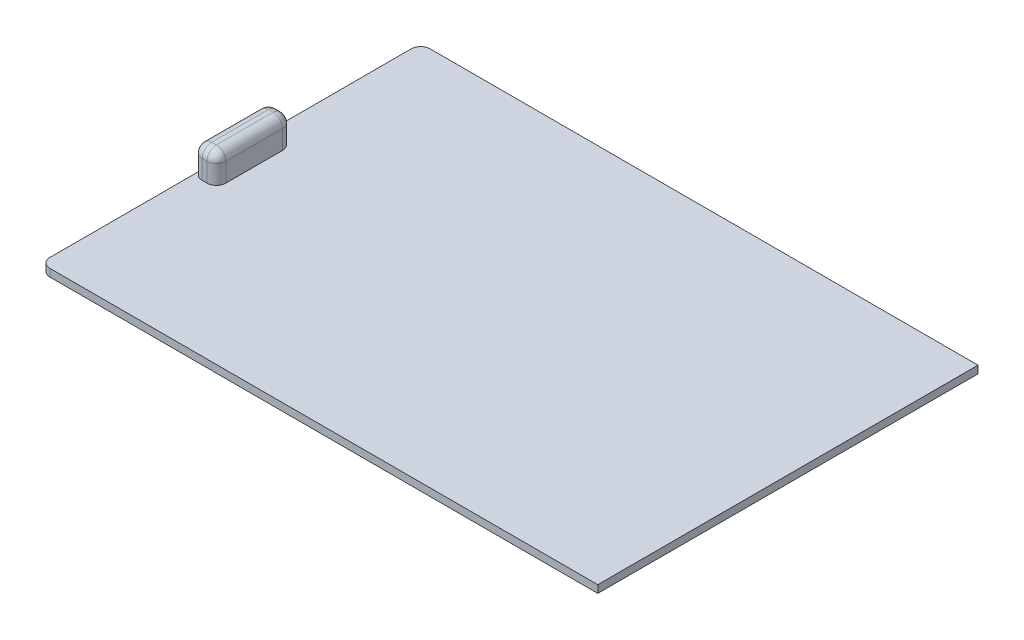
ISO-10303-21;
HEADER;
FILE_DESCRIPTION(('STEP AP214'),'2;1');
FILE_NAME('part.step','',(''),(''),'','','');
FILE_SCHEMA(('AUTOMOTIVE_DESIGN { 1 0 10303 214 1 1 1 1 }'));
ENDSEC;
DATA;
#1=APPLICATION_CONTEXT('core data for automotive mechanical design processes');
#2=APPLICATION_PROTOCOL_DEFINITION('international standard','automotive_design',2000,#1);
#3=PRODUCT_CONTEXT('',#1,'mechanical');
#4=PRODUCT('Part','Part','',(#3));
#5=PRODUCT_RELATED_PRODUCT_CATEGORY('part','',(#4));
#6=PRODUCT_DEFINITION_FORMATION('','',#4);
#7=PRODUCT_DEFINITION_CONTEXT('part definition',#1,'design');
#8=PRODUCT_DEFINITION('design','',#6,#7);
#9=PRODUCT_DEFINITION_SHAPE('','',#8);
#10=(LENGTH_UNIT() NAMED_UNIT(*) SI_UNIT(.MILLI.,.METRE.));
#11=(NAMED_UNIT(*) PLANE_ANGLE_UNIT() SI_UNIT($,.RADIAN.));
#12=(NAMED_UNIT(*) SI_UNIT($,.STERADIAN.) SOLID_ANGLE_UNIT());
#13=UNCERTAINTY_MEASURE_WITH_UNIT(LENGTH_MEASURE(1.E-05),#10,'distance_accuracy_value','');
#14=(GEOMETRIC_REPRESENTATION_CONTEXT(3) GLOBAL_UNCERTAINTY_ASSIGNED_CONTEXT((#13)) GLOBAL_UNIT_ASSIGNED_CONTEXT((#10,
#11,#12)) REPRESENTATION_CONTEXT('',''));
#15=CARTESIAN_POINT('',(0.,0.,0.));
#16=DIRECTION('',(0.,0.,1.));
#17=DIRECTION('',(1.,0.,0.));
#18=AXIS2_PLACEMENT_3D('',#15,#16,#17);
#19=CARTESIAN_POINT('',(0.,1.6,80.5));
#20=DIRECTION('',(1.,0.,0.));
#21=DIRECTION('',(0.,0.,-1.));
#22=AXIS2_PLACEMENT_3D('',#19,#20,#21);
#23=PLANE('',#22);
#24=DIRECTION('',(0.,0.,1.));
#25=VECTOR('',#24,1.);
#26=CARTESIAN_POINT('',(0.,1.6,80.5));
#27=LINE('',#26,#25);
#28=CARTESIAN_POINT('',(0.,1.6,46.25));
#29=VERTEX_POINT('',#28);
#30=CARTESIAN_POINT('',(0.,1.6,78.5));
#31=VERTEX_POINT('',#30);
#32=EDGE_CURVE('E74',#29,#31,#27,.T.);
#33=ORIENTED_EDGE('',*,*,#32,.F.);
#34=DIRECTION('',(0.,-1.,0.));
#35=VECTOR('',#34,1.);
#36=CARTESIAN_POINT('',(0.,7.6,46.25));
#37=LINE('',#36,#35);
#38=CARTESIAN_POINT('',(0.,5.6,46.25));
#39=VERTEX_POINT('',#38);
#40=EDGE_CURVE('E79',#29,#39,#37,.F.);
#41=ORIENTED_EDGE('',*,*,#40,.T.);
#42=DIRECTION('',(0.,0.,1.));
#43=VECTOR('',#42,1.);
#44=CARTESIAN_POINT('',(0.,5.6,80.5));
#45=LINE('',#44,#43);
#46=CARTESIAN_POINT('',(0.,5.6,34.25));
#47=VERTEX_POINT('',#46);
#48=EDGE_CURVE('E289',#39,#47,#45,.F.);
#49=ORIENTED_EDGE('',*,*,#48,.T.);
#50=DIRECTION('',(0.,-1.,0.));
#51=VECTOR('',#50,1.);
#52=CARTESIAN_POINT('',(0.,1.6,34.25));
#53=LINE('',#52,#51);
#54=CARTESIAN_POINT('',(0.,1.6,34.25));
#55=VERTEX_POINT('',#54);
#56=EDGE_CURVE('E285',#47,#55,#53,.T.);
#57=ORIENTED_EDGE('',*,*,#56,.T.);
#58=CARTESIAN_POINT('',(0.,1.6,2.));
#59=VERTEX_POINT('',#58);
#60=EDGE_CURVE('E182',#59,#55,#27,.T.);
#61=ORIENTED_EDGE('',*,*,#60,.F.);
#62=DIRECTION('',(0.,-1.,0.));
#63=VECTOR('',#62,1.);
#64=CARTESIAN_POINT('',(0.,1.6,2.));
#65=LINE('',#64,#63);
#66=CARTESIAN_POINT('',(0.,0.,2.));
#67=VERTEX_POINT('',#66);
#68=EDGE_CURVE('E223',#59,#67,#65,.T.);
#69=ORIENTED_EDGE('',*,*,#68,.T.);
#70=DIRECTION('',(0.,0.,1.));
#71=VECTOR('',#70,1.);
#72=CARTESIAN_POINT('',(0.,0.,80.5));
#73=LINE('',#72,#71);
#74=CARTESIAN_POINT('',(0.,0.,78.5));
#75=VERTEX_POINT('',#74);
#76=EDGE_CURVE('E205',#67,#75,#73,.T.);
#77=ORIENTED_EDGE('',*,*,#76,.T.);
#78=DIRECTION('',(0.,-1.,0.));
#79=VECTOR('',#78,1.);
#80=CARTESIAN_POINT('',(0.,1.6,78.5));
#81=LINE('',#80,#79);
#82=EDGE_CURVE('E192',#75,#31,#81,.F.);
#83=ORIENTED_EDGE('',*,*,#82,.T.);
#84=EDGE_LOOP('',(#33,#41,#49,#57,#61,#69,#77,#83));
#85=FACE_BOUND('',#84,.T.);
#86=ADVANCED_FACE('F56',(#85),#23,.F.);
#87=CARTESIAN_POINT('',(0.,1.6,80.5));
#88=DIRECTION('',(0.,0.,-1.));
#89=DIRECTION('',(-1.,0.,0.));
#90=AXIS2_PLACEMENT_3D('',#87,#88,#89);
#91=PLANE('',#90);
#92=DIRECTION('',(1.,0.,0.));
#93=VECTOR('',#92,1.);
#94=CARTESIAN_POINT('',(0.,1.6,80.5));
#95=LINE('',#94,#93);
#96=CARTESIAN_POINT('',(2.,1.6,80.5));
#97=VERTEX_POINT('',#96);
#98=CARTESIAN_POINT('',(118.,1.6,80.5));
#99=VERTEX_POINT('',#98);
#100=EDGE_CURVE('E169',#97,#99,#95,.T.);
#101=ORIENTED_EDGE('',*,*,#100,.F.);
#102=DIRECTION('',(0.,-1.,0.));
#103=VECTOR('',#102,1.);
#104=CARTESIAN_POINT('',(2.,1.6,80.5));
#105=LINE('',#104,#103);
#106=CARTESIAN_POINT('',(2.,0.,80.5));
#107=VERTEX_POINT('',#106);
#108=EDGE_CURVE('E241',#97,#107,#105,.T.);
#109=ORIENTED_EDGE('',*,*,#108,.T.);
#110=DIRECTION('',(1.,0.,0.));
#111=VECTOR('',#110,1.);
#112=CARTESIAN_POINT('',(0.,0.,80.5));
#113=LINE('',#112,#111);
#114=CARTESIAN_POINT('',(118.,0.,80.5));
#115=VERTEX_POINT('',#114);
#116=EDGE_CURVE('E188',#107,#115,#113,.T.);
#117=ORIENTED_EDGE('',*,*,#116,.T.);
#118=DIRECTION('',(0.,-1.,0.));
#119=VECTOR('',#118,1.);
#120=CARTESIAN_POINT('',(118.,1.6,80.5));
#121=LINE('',#120,#119);
#122=EDGE_CURVE('E185',#99,#115,#121,.T.);
#123=ORIENTED_EDGE('',*,*,#122,.F.);
#124=EDGE_LOOP('',(#101,#109,#117,#123));
#125=FACE_BOUND('',#124,.T.);
#126=ADVANCED_FACE('F186',(#125),#91,.F.);
#127=CARTESIAN_POINT('',(118.,1.6,80.5));
#128=DIRECTION('',(-1.,0.,0.));
#129=DIRECTION('',(0.,0.,1.));
#130=AXIS2_PLACEMENT_3D('',#127,#128,#129);
#131=PLANE('',#130);
#132=DIRECTION('',(0.,0.,-1.));
#133=VECTOR('',#132,1.);
#134=CARTESIAN_POINT('',(118.,0.,80.5));
#135=LINE('',#134,#133);
#136=CARTESIAN_POINT('',(118.,0.,0.));
#137=VERTEX_POINT('',#136);
#138=EDGE_CURVE('E212',#115,#137,#135,.T.);
#139=ORIENTED_EDGE('',*,*,#138,.T.);
#140=DIRECTION('',(0.,-1.,0.));
#141=VECTOR('',#140,1.);
#142=CARTESIAN_POINT('',(118.,1.6,0.));
#143=LINE('',#142,#141);
#144=CARTESIAN_POINT('',(118.,1.6,0.));
#145=VERTEX_POINT('',#144);
#146=EDGE_CURVE('E193',#145,#137,#143,.T.);
#147=ORIENTED_EDGE('',*,*,#146,.F.);
#148=DIRECTION('',(0.,0.,-1.));
#149=VECTOR('',#148,1.);
#150=CARTESIAN_POINT('',(118.,1.6,80.5));
#151=LINE('',#150,#149);
#152=EDGE_CURVE('E174',#99,#145,#151,.T.);
#153=ORIENTED_EDGE('',*,*,#152,.F.);
#154=ORIENTED_EDGE('',*,*,#122,.T.);
#155=EDGE_LOOP('',(#139,#147,#153,#154));
#156=FACE_BOUND('',#155,.T.);
#157=ADVANCED_FACE('F195',(#156),#131,.F.);
#158=CARTESIAN_POINT('',(0.,1.6,0.));
#159=DIRECTION('',(0.,0.,1.));
#160=DIRECTION('',(1.,0.,0.));
#161=AXIS2_PLACEMENT_3D('',#158,#159,#160);
#162=PLANE('',#161);
#163=DIRECTION('',(-1.,0.,0.));
#164=VECTOR('',#163,1.);
#165=CARTESIAN_POINT('',(0.,0.,0.));
#166=LINE('',#165,#164);
#167=CARTESIAN_POINT('',(2.,0.,0.));
#168=VERTEX_POINT('',#167);
#169=EDGE_CURVE('E215',#137,#168,#166,.T.);
#170=ORIENTED_EDGE('',*,*,#169,.T.);
#171=DIRECTION('',(0.,-1.,0.));
#172=VECTOR('',#171,1.);
#173=CARTESIAN_POINT('',(2.,1.6,0.));
#174=LINE('',#173,#172);
#175=CARTESIAN_POINT('',(2.,1.6,0.));
#176=VERTEX_POINT('',#175);
#177=EDGE_CURVE('E233',#168,#176,#174,.F.);
#178=ORIENTED_EDGE('',*,*,#177,.T.);
#179=DIRECTION('',(-1.,0.,0.));
#180=VECTOR('',#179,1.);
#181=CARTESIAN_POINT('',(0.,1.6,0.));
#182=LINE('',#181,#180);
#183=EDGE_CURVE('E199',#145,#176,#182,.T.);
#184=ORIENTED_EDGE('',*,*,#183,.F.);
#185=ORIENTED_EDGE('',*,*,#146,.T.);
#186=EDGE_LOOP('',(#170,#178,#184,#185));
#187=FACE_BOUND('',#186,.T.);
#188=ADVANCED_FACE('F371',(#187),#162,.F.);
#189=CARTESIAN_POINT('',(0.,1.6,0.));
#190=DIRECTION('',(0.,-1.,0.));
#191=DIRECTION('',(0.,0.,-1.));
#192=AXIS2_PLACEMENT_3D('',#189,#190,#191);
#193=PLANE('',#192);
#194=ORIENTED_EDGE('',*,*,#60,.T.);
#195=CARTESIAN_POINT('',(2.,1.6,34.25));
#196=DIRECTION('',(0.,-1.,0.));
#197=DIRECTION('',(0.,0.,-1.));
#198=AXIS2_PLACEMENT_3D('',#195,#196,#197);
#199=CIRCLE('',#198,2.);
#200=CARTESIAN_POINT('',(2.,1.6,32.25));
#201=VERTEX_POINT('',#200);
#202=EDGE_CURVE('E13',#55,#201,#199,.T.);
#203=ORIENTED_EDGE('',*,*,#202,.T.);
#204=DIRECTION('',(1.,0.,0.));
#205=VECTOR('',#204,1.);
#206=CARTESIAN_POINT('',(0.,1.6,32.25));
#207=LINE('',#206,#205);
#208=CARTESIAN_POINT('',(3.,1.6,32.25));
#209=VERTEX_POINT('',#208);
#210=EDGE_CURVE('E209',#201,#209,#207,.T.);
#211=ORIENTED_EDGE('',*,*,#210,.T.);
#212=CARTESIAN_POINT('',(3.,1.6,34.25));
#213=DIRECTION('',(0.,-1.,0.));
#214=DIRECTION('',(0.,0.,-1.));
#215=AXIS2_PLACEMENT_3D('',#212,#213,#214);
#216=CIRCLE('',#215,2.);
#217=CARTESIAN_POINT('',(5.,1.6,34.25));
#218=VERTEX_POINT('',#217);
#219=EDGE_CURVE('E294',#209,#218,#216,.T.);
#220=ORIENTED_EDGE('',*,*,#219,.T.);
#221=DIRECTION('',(0.,0.,1.));
#222=VECTOR('',#221,1.);
#223=CARTESIAN_POINT('',(5.,1.6,32.25));
#224=LINE('',#223,#222);
#225=CARTESIAN_POINT('',(5.00000000000001,1.6,46.25));
#226=VERTEX_POINT('',#225);
#227=EDGE_CURVE('E350',#218,#226,#224,.T.);
#228=ORIENTED_EDGE('',*,*,#227,.T.);
#229=CARTESIAN_POINT('',(3.,1.6,46.25));
#230=DIRECTION('',(0.,-1.,0.));
#231=DIRECTION('',(0.,0.,-1.));
#232=AXIS2_PLACEMENT_3D('',#229,#230,#231);
#233=CIRCLE('',#232,2.);
#234=CARTESIAN_POINT('',(3.,1.6,48.25));
#235=VERTEX_POINT('',#234);
#236=EDGE_CURVE('E297',#226,#235,#233,.T.);
#237=ORIENTED_EDGE('',*,*,#236,.T.);
#238=DIRECTION('',(-1.,0.,0.));
#239=VECTOR('',#238,1.);
#240=CARTESIAN_POINT('',(5.00000000000001,1.6,48.25));
#241=LINE('',#240,#239);
#242=CARTESIAN_POINT('',(2.,1.6,48.25));
#243=VERTEX_POINT('',#242);
#244=EDGE_CURVE('E346',#235,#243,#241,.T.);
#245=ORIENTED_EDGE('',*,*,#244,.T.);
#246=CARTESIAN_POINT('',(2.,1.6,46.25));
#247=DIRECTION('',(0.,-1.,0.));
#248=DIRECTION('',(0.,0.,-1.));
#249=AXIS2_PLACEMENT_3D('',#246,#247,#248);
#250=CIRCLE('',#249,2.);
#251=EDGE_CURVE('E66',#243,#29,#250,.T.);
#252=ORIENTED_EDGE('',*,*,#251,.T.);
#253=ORIENTED_EDGE('',*,*,#32,.T.);
#254=CARTESIAN_POINT('',(2.,1.6,78.5));
#255=DIRECTION('',(0.,-1.,0.));
#256=DIRECTION('',(0.,0.,-1.));
#257=AXIS2_PLACEMENT_3D('',#254,#255,#256);
#258=CIRCLE('',#257,2.);
#259=EDGE_CURVE('E177',#31,#97,#258,.F.);
#260=ORIENTED_EDGE('',*,*,#259,.T.);
#261=ORIENTED_EDGE('',*,*,#100,.T.);
#262=ORIENTED_EDGE('',*,*,#152,.T.);
#263=ORIENTED_EDGE('',*,*,#183,.T.);
#264=CARTESIAN_POINT('',(2.,1.6,2.));
#265=DIRECTION('',(0.,-1.,0.));
#266=DIRECTION('',(0.,0.,-1.));
#267=AXIS2_PLACEMENT_3D('',#264,#265,#266);
#268=CIRCLE('',#267,2.);
#269=EDGE_CURVE('E238',#176,#59,#268,.F.);
#270=ORIENTED_EDGE('',*,*,#269,.T.);
#271=EDGE_LOOP('',(#194,#203,#211,#220,#228,#237,#245,#252,#253,#260,#261,#262,#263,#270));
#272=FACE_BOUND('',#271,.T.);
#273=ADVANCED_FACE('F171',(#272),#193,.F.);
#274=CARTESIAN_POINT('',(0.,0.,0.));
#275=DIRECTION('',(0.,-1.,0.));
#276=DIRECTION('',(0.,0.,-1.));
#277=AXIS2_PLACEMENT_3D('',#274,#275,#276);
#278=PLANE('',#277);
#279=ORIENTED_EDGE('',*,*,#76,.F.);
#280=CARTESIAN_POINT('',(2.,0.,2.));
#281=DIRECTION('',(0.,-1.,0.));
#282=DIRECTION('',(0.,0.,-1.));
#283=AXIS2_PLACEMENT_3D('',#280,#281,#282);
#284=CIRCLE('',#283,2.);
#285=EDGE_CURVE('E230',#67,#168,#284,.T.);
#286=ORIENTED_EDGE('',*,*,#285,.T.);
#287=ORIENTED_EDGE('',*,*,#169,.F.);
#288=ORIENTED_EDGE('',*,*,#138,.F.);
#289=ORIENTED_EDGE('',*,*,#116,.F.);
#290=CARTESIAN_POINT('',(2.,0.,78.5));
#291=DIRECTION('',(0.,-1.,0.));
#292=DIRECTION('',(0.,0.,-1.));
#293=AXIS2_PLACEMENT_3D('',#290,#291,#292);
#294=CIRCLE('',#293,2.);
#295=EDGE_CURVE('E227',#107,#75,#294,.T.);
#296=ORIENTED_EDGE('',*,*,#295,.T.);
#297=EDGE_LOOP('',(#279,#286,#287,#288,#289,#296));
#298=FACE_BOUND('',#297,.T.);
#299=ADVANCED_FACE('F368',(#298),#278,.T.);
#300=CARTESIAN_POINT('',(2.,1.6,2.));
#301=DIRECTION('',(0.,-1.,0.));
#302=DIRECTION('',(0.,0.,-1.));
#303=AXIS2_PLACEMENT_3D('',#300,#301,#302);
#304=CYLINDRICAL_SURFACE('',#303,2.);
#305=ORIENTED_EDGE('',*,*,#269,.F.);
#306=ORIENTED_EDGE('',*,*,#177,.F.);
#307=ORIENTED_EDGE('',*,*,#285,.F.);
#308=ORIENTED_EDGE('',*,*,#68,.F.);
#309=EDGE_LOOP('',(#305,#306,#307,#308));
#310=FACE_BOUND('',#309,.T.);
#311=ADVANCED_FACE('F376',(#310),#304,.T.);
#312=CARTESIAN_POINT('',(2.,1.6,78.5));
#313=DIRECTION('',(0.,-1.,0.));
#314=DIRECTION('',(0.,0.,-1.));
#315=AXIS2_PLACEMENT_3D('',#312,#313,#314);
#316=CYLINDRICAL_SURFACE('',#315,2.);
#317=ORIENTED_EDGE('',*,*,#259,.F.);
#318=ORIENTED_EDGE('',*,*,#82,.F.);
#319=ORIENTED_EDGE('',*,*,#295,.F.);
#320=ORIENTED_EDGE('',*,*,#108,.F.);
#321=EDGE_LOOP('',(#317,#318,#319,#320));
#322=FACE_BOUND('',#321,.T.);
#323=ADVANCED_FACE('F366',(#322),#316,.T.);
#324=CARTESIAN_POINT('',(5.00000000000001,7.6,48.25));
#325=DIRECTION('',(0.,0.,1.));
#326=DIRECTION('',(1.,0.,0.));
#327=AXIS2_PLACEMENT_3D('',#324,#325,#326);
#328=PLANE('',#327);
#329=ORIENTED_EDGE('',*,*,#244,.F.);
#330=DIRECTION('',(0.,-1.,0.));
#331=VECTOR('',#330,1.);
#332=CARTESIAN_POINT('',(3.,7.6,48.25));
#333=LINE('',#332,#331);
#334=CARTESIAN_POINT('',(3.,5.6,48.25));
#335=VERTEX_POINT('',#334);
#336=EDGE_CURVE('E273',#235,#335,#333,.F.);
#337=ORIENTED_EDGE('',*,*,#336,.T.);
#338=DIRECTION('',(-1.,0.,0.));
#339=VECTOR('',#338,1.);
#340=CARTESIAN_POINT('',(0.,5.6,48.25));
#341=LINE('',#340,#339);
#342=CARTESIAN_POINT('',(2.,5.6,48.25));
#343=VERTEX_POINT('',#342);
#344=EDGE_CURVE('E270',#335,#343,#341,.T.);
#345=ORIENTED_EDGE('',*,*,#344,.T.);
#346=DIRECTION('',(0.,-1.,0.));
#347=VECTOR('',#346,1.);
#348=CARTESIAN_POINT('',(2.,1.6,48.25));
#349=LINE('',#348,#347);
#350=EDGE_CURVE('E267',#343,#243,#349,.T.);
#351=ORIENTED_EDGE('',*,*,#350,.T.);
#352=EDGE_LOOP('',(#329,#337,#345,#351));
#353=FACE_BOUND('',#352,.T.);
#354=ADVANCED_FACE('F423',(#353),#328,.T.);
#355=CARTESIAN_POINT('',(5.,7.6,32.25));
#356=DIRECTION('',(1.,0.,0.));
#357=DIRECTION('',(0.,0.,-1.));
#358=AXIS2_PLACEMENT_3D('',#355,#356,#357);
#359=PLANE('',#358);
#360=ORIENTED_EDGE('',*,*,#227,.F.);
#361=DIRECTION('',(0.,-1.,0.));
#362=VECTOR('',#361,1.);
#363=CARTESIAN_POINT('',(5.,7.6,34.25));
#364=LINE('',#363,#362);
#365=CARTESIAN_POINT('',(5.,5.6,34.25));
#366=VERTEX_POINT('',#365);
#367=EDGE_CURVE('E282',#218,#366,#364,.F.);
#368=ORIENTED_EDGE('',*,*,#367,.T.);
#369=DIRECTION('',(0.,0.,1.));
#370=VECTOR('',#369,1.);
#371=CARTESIAN_POINT('',(5.00000000000001,5.6,48.25));
#372=LINE('',#371,#370);
#373=CARTESIAN_POINT('',(5.00000000000001,5.6,46.25));
#374=VERTEX_POINT('',#373);
#375=EDGE_CURVE('E279',#366,#374,#372,.T.);
#376=ORIENTED_EDGE('',*,*,#375,.T.);
#377=DIRECTION('',(0.,-1.,0.));
#378=VECTOR('',#377,1.);
#379=CARTESIAN_POINT('',(5.00000000000001,7.6,46.25));
#380=LINE('',#379,#378);
#381=EDGE_CURVE('E276',#374,#226,#380,.T.);
#382=ORIENTED_EDGE('',*,*,#381,.T.);
#383=EDGE_LOOP('',(#360,#368,#376,#382));
#384=FACE_BOUND('',#383,.T.);
#385=ADVANCED_FACE('F398',(#384),#359,.T.);
#386=CARTESIAN_POINT('',(0.,7.6,32.25));
#387=DIRECTION('',(0.,0.,-1.));
#388=DIRECTION('',(-1.,0.,0.));
#389=AXIS2_PLACEMENT_3D('',#386,#387,#388);
#390=PLANE('',#389);
#391=DIRECTION('',(1.,0.,0.));
#392=VECTOR('',#391,1.);
#393=CARTESIAN_POINT('',(5.,5.6,32.25));
#394=LINE('',#393,#392);
#395=CARTESIAN_POINT('',(2.,5.6,32.25));
#396=VERTEX_POINT('',#395);
#397=CARTESIAN_POINT('',(3.,5.6,32.25));
#398=VERTEX_POINT('',#397);
#399=EDGE_CURVE('E247',#396,#398,#394,.T.);
#400=ORIENTED_EDGE('',*,*,#399,.T.);
#401=DIRECTION('',(0.,-1.,0.));
#402=VECTOR('',#401,1.);
#403=CARTESIAN_POINT('',(3.,7.6,32.25));
#404=LINE('',#403,#402);
#405=EDGE_CURVE('E251',#398,#209,#404,.T.);
#406=ORIENTED_EDGE('',*,*,#405,.T.);
#407=ORIENTED_EDGE('',*,*,#210,.F.);
#408=DIRECTION('',(0.,-1.,0.));
#409=VECTOR('',#408,1.);
#410=CARTESIAN_POINT('',(2.,7.6,32.25));
#411=LINE('',#410,#409);
#412=EDGE_CURVE('E244',#201,#396,#411,.F.);
#413=ORIENTED_EDGE('',*,*,#412,.T.);
#414=EDGE_LOOP('',(#400,#406,#407,#413));
#415=FACE_BOUND('',#414,.T.);
#416=ADVANCED_FACE('F388',(#415),#390,.T.);
#417=CARTESIAN_POINT('',(0.,7.6,0.));
#418=DIRECTION('',(0.,-1.,0.));
#419=DIRECTION('',(0.,0.,-1.));
#420=AXIS2_PLACEMENT_3D('',#417,#418,#419);
#421=PLANE('',#420);
#422=DIRECTION('',(-1.,0.,0.));
#423=VECTOR('',#422,1.);
#424=CARTESIAN_POINT('',(5.00000000000001,7.6,46.25));
#425=LINE('',#424,#423);
#426=CARTESIAN_POINT('',(2.,7.6,46.25));
#427=VERTEX_POINT('',#426);
#428=CARTESIAN_POINT('',(3.,7.6,46.25));
#429=VERTEX_POINT('',#428);
#430=EDGE_CURVE('E257',#427,#429,#425,.F.);
#431=ORIENTED_EDGE('',*,*,#430,.T.);
#432=DIRECTION('',(0.,0.,1.));
#433=VECTOR('',#432,1.);
#434=CARTESIAN_POINT('',(3.,7.6,32.25));
#435=LINE('',#434,#433);
#436=CARTESIAN_POINT('',(3.,7.6,34.25));
#437=VERTEX_POINT('',#436);
#438=EDGE_CURVE('E264',#429,#437,#435,.F.);
#439=ORIENTED_EDGE('',*,*,#438,.T.);
#440=DIRECTION('',(1.,0.,0.));
#441=VECTOR('',#440,1.);
#442=CARTESIAN_POINT('',(0.,7.6,34.25));
#443=LINE('',#442,#441);
#444=CARTESIAN_POINT('',(2.,7.6,34.25));
#445=VERTEX_POINT('',#444);
#446=EDGE_CURVE('E260',#437,#445,#443,.F.);
#447=ORIENTED_EDGE('',*,*,#446,.T.);
#448=DIRECTION('',(0.,0.,1.));
#449=VECTOR('',#448,1.);
#450=CARTESIAN_POINT('',(2.,7.6,0.));
#451=LINE('',#450,#449);
#452=EDGE_CURVE('E254',#445,#427,#451,.T.);
#453=ORIENTED_EDGE('',*,*,#452,.T.);
#454=EDGE_LOOP('',(#431,#439,#447,#453));
#455=FACE_BOUND('',#454,.T.);
#456=ADVANCED_FACE('F415',(#455),#421,.F.);
#457=CARTESIAN_POINT('',(2.,7.6,46.25));
#458=DIRECTION('',(0.,1.,0.));
#459=DIRECTION('',(0.,0.,1.));
#460=AXIS2_PLACEMENT_3D('',#457,#458,#459);
#461=CYLINDRICAL_SURFACE('',#460,2.);
#462=ORIENTED_EDGE('',*,*,#251,.F.);
#463=ORIENTED_EDGE('',*,*,#350,.F.);
#464=CARTESIAN_POINT('',(2.,5.6,46.25));
#465=DIRECTION('',(0.,1.,0.));
#466=DIRECTION('',(0.,0.,1.));
#467=AXIS2_PLACEMENT_3D('',#464,#465,#466);
#468=CIRCLE('',#467,2.);
#469=EDGE_CURVE('E339',#39,#343,#468,.T.);
#470=ORIENTED_EDGE('',*,*,#469,.F.);
#471=ORIENTED_EDGE('',*,*,#40,.F.);
#472=EDGE_LOOP('',(#462,#463,#470,#471));
#473=FACE_BOUND('',#472,.T.);
#474=ADVANCED_FACE('F58',(#473),#461,.T.);
#475=CARTESIAN_POINT('',(3.,7.6,46.25));
#476=DIRECTION('',(0.,-1.,0.));
#477=DIRECTION('',(0.,0.,-1.));
#478=AXIS2_PLACEMENT_3D('',#475,#476,#477);
#479=CYLINDRICAL_SURFACE('',#478,2.);
#480=ORIENTED_EDGE('',*,*,#236,.F.);
#481=ORIENTED_EDGE('',*,*,#381,.F.);
#482=CARTESIAN_POINT('',(3.,5.6,46.25));
#483=DIRECTION('',(0.,1.,0.));
#484=DIRECTION('',(0.,0.,1.));
#485=AXIS2_PLACEMENT_3D('',#482,#483,#484);
#486=CIRCLE('',#485,2.);
#487=EDGE_CURVE('E336',#335,#374,#486,.T.);
#488=ORIENTED_EDGE('',*,*,#487,.F.);
#489=ORIENTED_EDGE('',*,*,#336,.F.);
#490=EDGE_LOOP('',(#480,#481,#488,#489));
#491=FACE_BOUND('',#490,.T.);
#492=ADVANCED_FACE('F403',(#491),#479,.T.);
#493=CARTESIAN_POINT('',(5.00000000000001,5.6,46.25));
#494=DIRECTION('',(1.,0.,0.));
#495=DIRECTION('',(0.,0.,-1.));
#496=AXIS2_PLACEMENT_3D('',#493,#494,#495);
#497=CYLINDRICAL_SURFACE('',#496,2.);
#498=CARTESIAN_POINT('',(2.,5.6,46.25));
#499=DIRECTION('',(-1.,0.,0.));
#500=DIRECTION('',(0.,0.,1.));
#501=AXIS2_PLACEMENT_3D('',#498,#499,#500);
#502=CIRCLE('',#501,2.);
#503=EDGE_CURVE('E60',#343,#427,#502,.T.);
#504=ORIENTED_EDGE('',*,*,#503,.F.);
#505=ORIENTED_EDGE('',*,*,#344,.F.);
#506=CARTESIAN_POINT('',(3.,5.6,46.25));
#507=DIRECTION('',(1.,0.,0.));
#508=DIRECTION('',(0.,0.,-1.));
#509=AXIS2_PLACEMENT_3D('',#506,#507,#508);
#510=CIRCLE('',#509,2.);
#511=EDGE_CURVE('E332',#429,#335,#510,.T.);
#512=ORIENTED_EDGE('',*,*,#511,.F.);
#513=ORIENTED_EDGE('',*,*,#430,.F.);
#514=EDGE_LOOP('',(#504,#505,#512,#513));
#515=FACE_BOUND('',#514,.T.);
#516=ADVANCED_FACE('F420',(#515),#497,.T.);
#517=CARTESIAN_POINT('',(2.,5.6,46.25));
#518=DIRECTION('',(0.,0.,1.));
#519=DIRECTION('',(1.,0.,0.));
#520=AXIS2_PLACEMENT_3D('',#517,#518,#519);
#521=SPHERICAL_SURFACE('',#520,2.);
#522=ORIENTED_EDGE('',*,*,#469,.T.);
#523=ORIENTED_EDGE('',*,*,#503,.T.);
#524=CARTESIAN_POINT('',(2.,5.6,46.25));
#525=DIRECTION('',(0.,0.,1.));
#526=DIRECTION('',(1.,0.,0.));
#527=AXIS2_PLACEMENT_3D('',#524,#525,#526);
#528=CIRCLE('',#527,2.);
#529=EDGE_CURVE('E328',#39,#427,#528,.F.);
#530=ORIENTED_EDGE('',*,*,#529,.F.);
#531=EDGE_LOOP('',(#522,#523,#530));
#532=FACE_BOUND('',#531,.T.);
#533=ADVANCED_FACE('F425',(#532),#521,.T.);
#534=CARTESIAN_POINT('',(3.,5.6,46.25));
#535=DIRECTION('',(0.,0.,1.));
#536=DIRECTION('',(1.,0.,0.));
#537=AXIS2_PLACEMENT_3D('',#534,#535,#536);
#538=SPHERICAL_SURFACE('',#537,2.);
#539=ORIENTED_EDGE('',*,*,#511,.T.);
#540=ORIENTED_EDGE('',*,*,#487,.T.);
#541=CARTESIAN_POINT('',(3.00000000000001,5.6,46.25));
#542=DIRECTION('',(0.,0.,1.));
#543=DIRECTION('',(1.,0.,0.));
#544=AXIS2_PLACEMENT_3D('',#541,#542,#543);
#545=CIRCLE('',#544,2.);
#546=EDGE_CURVE('E324',#429,#374,#545,.F.);
#547=ORIENTED_EDGE('',*,*,#546,.F.);
#548=EDGE_LOOP('',(#539,#540,#547));
#549=FACE_BOUND('',#548,.T.);
#550=ADVANCED_FACE('F407',(#549),#538,.T.);
#551=CARTESIAN_POINT('',(2.,5.6,0.));
#552=DIRECTION('',(0.,0.,1.));
#553=DIRECTION('',(1.,0.,0.));
#554=AXIS2_PLACEMENT_3D('',#551,#552,#553);
#555=CYLINDRICAL_SURFACE('',#554,2.);
#556=ORIENTED_EDGE('',*,*,#529,.T.);
#557=ORIENTED_EDGE('',*,*,#452,.F.);
#558=CARTESIAN_POINT('',(2.,5.6,34.25));
#559=DIRECTION('',(0.,0.,-1.));
#560=DIRECTION('',(-1.,0.,0.));
#561=AXIS2_PLACEMENT_3D('',#558,#559,#560);
#562=CIRCLE('',#561,2.);
#563=EDGE_CURVE('E320',#47,#445,#562,.T.);
#564=ORIENTED_EDGE('',*,*,#563,.F.);
#565=ORIENTED_EDGE('',*,*,#48,.F.);
#566=EDGE_LOOP('',(#556,#557,#564,#565));
#567=FACE_BOUND('',#566,.T.);
#568=ADVANCED_FACE('F427',(#567),#555,.T.);
#569=CARTESIAN_POINT('',(2.,1.6,34.25));
#570=DIRECTION('',(0.,1.,0.));
#571=DIRECTION('',(0.,0.,1.));
#572=AXIS2_PLACEMENT_3D('',#569,#570,#571);
#573=CYLINDRICAL_SURFACE('',#572,2.);
#574=ORIENTED_EDGE('',*,*,#202,.F.);
#575=ORIENTED_EDGE('',*,*,#56,.F.);
#576=CARTESIAN_POINT('',(2.,5.6,34.25));
#577=DIRECTION('',(0.,1.,0.));
#578=DIRECTION('',(0.,0.,1.));
#579=AXIS2_PLACEMENT_3D('',#576,#577,#578);
#580=CIRCLE('',#579,2.);
#581=EDGE_CURVE('E316',#396,#47,#580,.T.);
#582=ORIENTED_EDGE('',*,*,#581,.F.);
#583=ORIENTED_EDGE('',*,*,#412,.F.);
#584=EDGE_LOOP('',(#574,#575,#582,#583));
#585=FACE_BOUND('',#584,.T.);
#586=ADVANCED_FACE('F384',(#585),#573,.T.);
#587=CARTESIAN_POINT('',(3.,7.6,34.25));
#588=DIRECTION('',(0.,-1.,0.));
#589=DIRECTION('',(0.,0.,-1.));
#590=AXIS2_PLACEMENT_3D('',#587,#588,#589);
#591=CYLINDRICAL_SURFACE('',#590,2.);
#592=ORIENTED_EDGE('',*,*,#219,.F.);
#593=ORIENTED_EDGE('',*,*,#405,.F.);
#594=CARTESIAN_POINT('',(3.,5.6,34.25));
#595=DIRECTION('',(0.,1.,0.));
#596=DIRECTION('',(0.,0.,1.));
#597=AXIS2_PLACEMENT_3D('',#594,#595,#596);
#598=CIRCLE('',#597,2.);
#599=EDGE_CURVE('E312',#366,#398,#598,.T.);
#600=ORIENTED_EDGE('',*,*,#599,.F.);
#601=ORIENTED_EDGE('',*,*,#367,.F.);
#602=EDGE_LOOP('',(#592,#593,#600,#601));
#603=FACE_BOUND('',#602,.T.);
#604=ADVANCED_FACE('F393',(#603),#591,.T.);
#605=CARTESIAN_POINT('',(3.,5.6,32.25));
#606=DIRECTION('',(0.,0.,-1.));
#607=DIRECTION('',(-1.,0.,0.));
#608=AXIS2_PLACEMENT_3D('',#605,#606,#607);
#609=CYLINDRICAL_SURFACE('',#608,2.);
#610=ORIENTED_EDGE('',*,*,#546,.T.);
#611=ORIENTED_EDGE('',*,*,#375,.F.);
#612=CARTESIAN_POINT('',(3.,5.6,34.25));
#613=DIRECTION('',(0.,0.,-1.));
#614=DIRECTION('',(-1.,0.,0.));
#615=AXIS2_PLACEMENT_3D('',#612,#613,#614);
#616=CIRCLE('',#615,2.);
#617=EDGE_CURVE('E308',#437,#366,#616,.T.);
#618=ORIENTED_EDGE('',*,*,#617,.F.);
#619=ORIENTED_EDGE('',*,*,#438,.F.);
#620=EDGE_LOOP('',(#610,#611,#618,#619));
#621=FACE_BOUND('',#620,.T.);
#622=ADVANCED_FACE('F411',(#621),#609,.T.);
#623=CARTESIAN_POINT('',(2.,5.6,34.25));
#624=DIRECTION('',(-1.,0.,0.));
#625=DIRECTION('',(0.,0.,1.));
#626=AXIS2_PLACEMENT_3D('',#623,#624,#625);
#627=SPHERICAL_SURFACE('',#626,2.);
#628=ORIENTED_EDGE('',*,*,#581,.T.);
#629=ORIENTED_EDGE('',*,*,#563,.T.);
#630=CARTESIAN_POINT('',(2.,5.6,34.25));
#631=DIRECTION('',(-1.,0.,0.));
#632=DIRECTION('',(0.,0.,1.));
#633=AXIS2_PLACEMENT_3D('',#630,#631,#632);
#634=CIRCLE('',#633,2.);
#635=EDGE_CURVE('E305',#396,#445,#634,.F.);
#636=ORIENTED_EDGE('',*,*,#635,.F.);
#637=EDGE_LOOP('',(#628,#629,#636));
#638=FACE_BOUND('',#637,.T.);
#639=ADVANCED_FACE('F430',(#638),#627,.T.);
#640=CARTESIAN_POINT('',(3.,5.6,34.25));
#641=DIRECTION('',(1.,0.,0.));
#642=DIRECTION('',(0.,0.,-1.));
#643=AXIS2_PLACEMENT_3D('',#640,#641,#642);
#644=SPHERICAL_SURFACE('',#643,2.);
#645=ORIENTED_EDGE('',*,*,#617,.T.);
#646=ORIENTED_EDGE('',*,*,#599,.T.);
#647=CARTESIAN_POINT('',(3.,5.6,34.25));
#648=DIRECTION('',(1.,0.,0.));
#649=DIRECTION('',(0.,0.,-1.));
#650=AXIS2_PLACEMENT_3D('',#647,#648,#649);
#651=CIRCLE('',#650,2.);
#652=EDGE_CURVE('E302',#437,#398,#651,.F.);
#653=ORIENTED_EDGE('',*,*,#652,.F.);
#654=EDGE_LOOP('',(#645,#646,#653));
#655=FACE_BOUND('',#654,.T.);
#656=ADVANCED_FACE('F435',(#655),#644,.T.);
#657=CARTESIAN_POINT('',(0.,5.6,34.25));
#658=DIRECTION('',(-1.,0.,0.));
#659=DIRECTION('',(0.,0.,1.));
#660=AXIS2_PLACEMENT_3D('',#657,#658,#659);
#661=CYLINDRICAL_SURFACE('',#660,2.);
#662=ORIENTED_EDGE('',*,*,#635,.T.);
#663=ORIENTED_EDGE('',*,*,#446,.F.);
#664=ORIENTED_EDGE('',*,*,#652,.T.);
#665=ORIENTED_EDGE('',*,*,#399,.F.);
#666=EDGE_LOOP('',(#662,#663,#664,#665));
#667=FACE_BOUND('',#666,.T.);
#668=ADVANCED_FACE('F432',(#667),#661,.T.);
#669=CLOSED_SHELL('',(#86,#126,#157,#188,#273,#299,#311,#323,#354,#385,#416,#456,#474,#492,#516,
#533,#550,#568,#586,#604,#622,#639,#656,#668));
#670=MANIFOLD_SOLID_BREP('B2',#669);
#671=ADVANCED_BREP_SHAPE_REPRESENTATION('',(#18,#670),#14);
#672=SHAPE_DEFINITION_REPRESENTATION(#9,#671);
ENDSEC;
END-ISO-10303-21;
